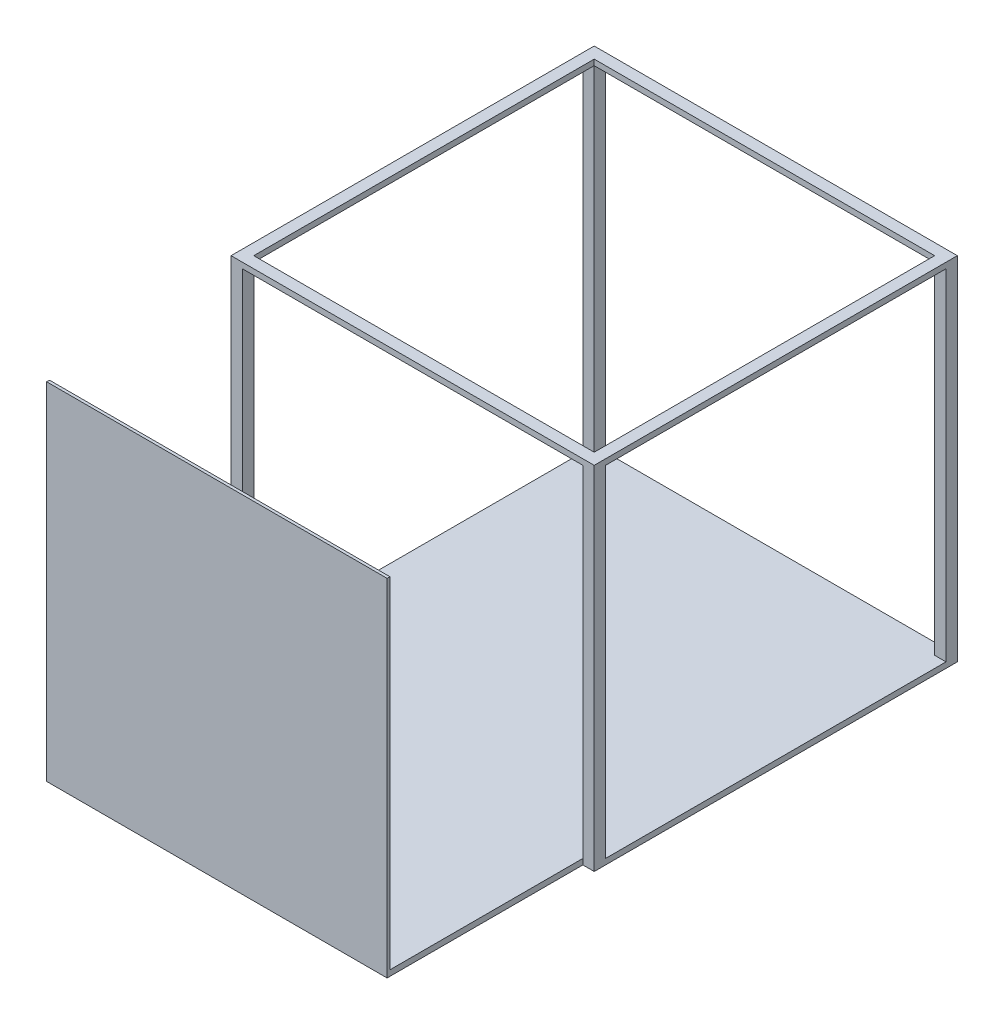
ISO-10303-21;
HEADER;
FILE_DESCRIPTION(('STEP AP214'),'2;1');
FILE_NAME('part.step','',(''),(''),'','','');
FILE_SCHEMA(('AUTOMOTIVE_DESIGN { 1 0 10303 214 1 1 1 1 }'));
ENDSEC;
DATA;
#1=APPLICATION_CONTEXT('core data for automotive mechanical design processes');
#2=APPLICATION_PROTOCOL_DEFINITION('international standard','automotive_design',2000,#1);
#3=PRODUCT_CONTEXT('',#1,'mechanical');
#4=PRODUCT('Part','Part','',(#3));
#5=PRODUCT_RELATED_PRODUCT_CATEGORY('part','',(#4));
#6=PRODUCT_DEFINITION_FORMATION('','',#4);
#7=PRODUCT_DEFINITION_CONTEXT('part definition',#1,'design');
#8=PRODUCT_DEFINITION('design','',#6,#7);
#9=PRODUCT_DEFINITION_SHAPE('','',#8);
#10=(LENGTH_UNIT() NAMED_UNIT(*) SI_UNIT(.MILLI.,.METRE.));
#11=(NAMED_UNIT(*) PLANE_ANGLE_UNIT() SI_UNIT($,.RADIAN.));
#12=(NAMED_UNIT(*) SI_UNIT($,.STERADIAN.) SOLID_ANGLE_UNIT());
#13=UNCERTAINTY_MEASURE_WITH_UNIT(LENGTH_MEASURE(1.E-05),#10,'distance_accuracy_value','');
#14=(GEOMETRIC_REPRESENTATION_CONTEXT(3) GLOBAL_UNCERTAINTY_ASSIGNED_CONTEXT((#13)) GLOBAL_UNIT_ASSIGNED_CONTEXT((#10,
#11,#12)) REPRESENTATION_CONTEXT('',''));
#15=CARTESIAN_POINT('',(0.,0.,0.));
#16=DIRECTION('',(0.,0.,1.));
#17=DIRECTION('',(1.,0.,0.));
#18=AXIS2_PLACEMENT_3D('',#15,#16,#17);
#19=CARTESIAN_POINT('',(0.,6.35,0.));
#20=DIRECTION('',(0.,-1.,0.));
#21=DIRECTION('',(0.,0.,-1.));
#22=AXIS2_PLACEMENT_3D('',#19,#20,#21);
#23=PLANE('',#22);
#24=DIRECTION('',(-1.,0.,0.));
#25=VECTOR('',#24,1.);
#26=CARTESIAN_POINT('',(-203.2,6.35,190.5));
#27=LINE('',#26,#25);
#28=CARTESIAN_POINT('',(-190.5,6.35,190.5));
#29=VERTEX_POINT('',#28);
#30=CARTESIAN_POINT('',(-203.2,6.35,190.5));
#31=VERTEX_POINT('',#30);
#32=EDGE_CURVE('E74',#29,#31,#27,.T.);
#33=ORIENTED_EDGE('',*,*,#32,.F.);
#34=DIRECTION('',(0.,0.,-1.));
#35=VECTOR('',#34,1.);
#36=CARTESIAN_POINT('',(-190.5,6.35,203.2));
#37=LINE('',#36,#35);
#38=CARTESIAN_POINT('',(-190.5,6.35,203.2));
#39=VERTEX_POINT('',#38);
#40=EDGE_CURVE('E403',#39,#29,#37,.T.);
#41=ORIENTED_EDGE('',*,*,#40,.F.);
#42=DIRECTION('',(0.,0.,1.));
#43=VECTOR('',#42,1.);
#44=CARTESIAN_POINT('',(-190.5,6.35,190.5));
#45=LINE('',#44,#43);
#46=CARTESIAN_POINT('',(-190.5,6.35,419.1));
#47=VERTEX_POINT('',#46);
#48=EDGE_CURVE('E292',#39,#47,#45,.T.);
#49=ORIENTED_EDGE('',*,*,#48,.T.);
#50=DIRECTION('',(1.,0.,0.));
#51=VECTOR('',#50,1.);
#52=CARTESIAN_POINT('',(-190.5,6.35,419.1));
#53=LINE('',#52,#51);
#54=CARTESIAN_POINT('',(190.5,6.35,419.1));
#55=VERTEX_POINT('',#54);
#56=EDGE_CURVE('E300',#47,#55,#53,.T.);
#57=ORIENTED_EDGE('',*,*,#56,.T.);
#58=DIRECTION('',(0.,0.,-1.));
#59=VECTOR('',#58,1.);
#60=CARTESIAN_POINT('',(190.5,6.35,190.5));
#61=LINE('',#60,#59);
#62=CARTESIAN_POINT('',(190.5,6.35,203.2));
#63=VERTEX_POINT('',#62);
#64=EDGE_CURVE('E257',#55,#63,#61,.T.);
#65=ORIENTED_EDGE('',*,*,#64,.T.);
#66=DIRECTION('',(0.,0.,1.));
#67=VECTOR('',#66,1.);
#68=CARTESIAN_POINT('',(190.5,6.35,203.2));
#69=LINE('',#68,#67);
#70=CARTESIAN_POINT('',(190.5,6.35,190.5));
#71=VERTEX_POINT('',#70);
#72=EDGE_CURVE('E426',#71,#63,#69,.T.);
#73=ORIENTED_EDGE('',*,*,#72,.F.);
#74=DIRECTION('',(-1.,0.,0.));
#75=VECTOR('',#74,1.);
#76=CARTESIAN_POINT('',(203.2,6.35,190.5));
#77=LINE('',#76,#75);
#78=CARTESIAN_POINT('',(203.2,6.35,190.5));
#79=VERTEX_POINT('',#78);
#80=EDGE_CURVE('E430',#79,#71,#77,.T.);
#81=ORIENTED_EDGE('',*,*,#80,.F.);
#82=DIRECTION('',(0.,0.,-1.));
#83=VECTOR('',#82,1.);
#84=CARTESIAN_POINT('',(203.2,6.35,203.2));
#85=LINE('',#84,#83);
#86=CARTESIAN_POINT('',(203.2,6.35,-190.5));
#87=VERTEX_POINT('',#86);
#88=EDGE_CURVE('E493',#79,#87,#85,.T.);
#89=ORIENTED_EDGE('',*,*,#88,.T.);
#90=DIRECTION('',(1.,0.,0.));
#91=VECTOR('',#90,1.);
#92=CARTESIAN_POINT('',(203.2,6.35,-190.5));
#93=LINE('',#92,#91);
#94=CARTESIAN_POINT('',(190.5,6.35,-190.5));
#95=VERTEX_POINT('',#94);
#96=EDGE_CURVE('E453',#95,#87,#93,.T.);
#97=ORIENTED_EDGE('',*,*,#96,.F.);
#98=DIRECTION('',(0.,0.,1.));
#99=VECTOR('',#98,1.);
#100=CARTESIAN_POINT('',(190.5,6.35,-203.2));
#101=LINE('',#100,#99);
#102=CARTESIAN_POINT('',(190.5,6.35,-203.2));
#103=VERTEX_POINT('',#102);
#104=EDGE_CURVE('E456',#103,#95,#101,.T.);
#105=ORIENTED_EDGE('',*,*,#104,.F.);
#106=DIRECTION('',(-1.,0.,0.));
#107=VECTOR('',#106,1.);
#108=CARTESIAN_POINT('',(-203.2,6.35,-203.2));
#109=LINE('',#108,#107);
#110=CARTESIAN_POINT('',(-190.5,6.35,-203.2));
#111=VERTEX_POINT('',#110);
#112=EDGE_CURVE('E496',#103,#111,#109,.T.);
#113=ORIENTED_EDGE('',*,*,#112,.T.);
#114=DIRECTION('',(0.,0.,-1.));
#115=VECTOR('',#114,1.);
#116=CARTESIAN_POINT('',(-190.5,6.35,-203.2));
#117=LINE('',#116,#115);
#118=CARTESIAN_POINT('',(-190.5,6.35,-190.5));
#119=VERTEX_POINT('',#118);
#120=EDGE_CURVE('E472',#119,#111,#117,.T.);
#121=ORIENTED_EDGE('',*,*,#120,.F.);
#122=DIRECTION('',(1.,0.,0.));
#123=VECTOR('',#122,1.);
#124=CARTESIAN_POINT('',(-203.2,6.35,-190.5));
#125=LINE('',#124,#123);
#126=CARTESIAN_POINT('',(-203.2,6.35,-190.5));
#127=VERTEX_POINT('',#126);
#128=EDGE_CURVE('E460',#127,#119,#125,.T.);
#129=ORIENTED_EDGE('',*,*,#128,.F.);
#130=DIRECTION('',(0.,0.,1.));
#131=VECTOR('',#130,1.);
#132=CARTESIAN_POINT('',(-203.2,6.35,203.2));
#133=LINE('',#132,#131);
#134=EDGE_CURVE('E81',#127,#31,#133,.T.);
#135=ORIENTED_EDGE('',*,*,#134,.T.);
#136=EDGE_LOOP('',(#33,#41,#49,#57,#65,#73,#81,#89,#97,#105,#113,#121,#129,#135));
#137=FACE_BOUND('',#136,.T.);
#138=ADVANCED_FACE('F55',(#137),#23,.F.);
#139=CARTESIAN_POINT('',(203.2,6.35,203.2));
#140=DIRECTION('',(-1.,0.,0.));
#141=DIRECTION('',(0.,0.,1.));
#142=AXIS2_PLACEMENT_3D('',#139,#140,#141);
#143=PLANE('',#142);
#144=DIRECTION('',(0.,-1.,0.));
#145=VECTOR('',#144,1.);
#146=CARTESIAN_POINT('',(203.2,6.35,-203.2));
#147=LINE('',#146,#145);
#148=CARTESIAN_POINT('',(203.2,393.7,-203.2));
#149=VERTEX_POINT('',#148);
#150=CARTESIAN_POINT('',(203.2,0.,-203.2));
#151=VERTEX_POINT('',#150);
#152=EDGE_CURVE('E11',#149,#151,#147,.T.);
#153=ORIENTED_EDGE('',*,*,#152,.F.);
#154=DIRECTION('',(0.,0.,-1.));
#155=VECTOR('',#154,1.);
#156=CARTESIAN_POINT('',(203.2,393.7,-203.2));
#157=LINE('',#156,#155);
#158=CARTESIAN_POINT('',(203.2,393.7,203.2));
#159=VERTEX_POINT('',#158);
#160=EDGE_CURVE('E366',#159,#149,#157,.T.);
#161=ORIENTED_EDGE('',*,*,#160,.F.);
#162=DIRECTION('',(0.,-1.,0.));
#163=VECTOR('',#162,1.);
#164=CARTESIAN_POINT('',(203.2,6.35,203.2));
#165=LINE('',#164,#163);
#166=CARTESIAN_POINT('',(203.2,0.,203.2));
#167=VERTEX_POINT('',#166);
#168=EDGE_CURVE('E501',#159,#167,#165,.T.);
#169=ORIENTED_EDGE('',*,*,#168,.T.);
#170=DIRECTION('',(0.,0.,-1.));
#171=VECTOR('',#170,1.);
#172=CARTESIAN_POINT('',(203.2,0.,203.2));
#173=LINE('',#172,#171);
#174=EDGE_CURVE('E492',#167,#151,#173,.T.);
#175=ORIENTED_EDGE('',*,*,#174,.T.);
#176=EDGE_LOOP('',(#153,#161,#169,#175));
#177=FACE_BOUND('',#176,.T.);
#178=DIRECTION('',(0.,0.,-1.));
#179=VECTOR('',#178,1.);
#180=CARTESIAN_POINT('',(203.2,387.35,-203.2));
#181=LINE('',#180,#179);
#182=CARTESIAN_POINT('',(203.2,387.35,190.5));
#183=VERTEX_POINT('',#182);
#184=CARTESIAN_POINT('',(203.2,387.35,-190.5));
#185=VERTEX_POINT('',#184);
#186=EDGE_CURVE('E382',#183,#185,#181,.T.);
#187=ORIENTED_EDGE('',*,*,#186,.T.);
#188=DIRECTION('',(0.,-1.,0.));
#189=VECTOR('',#188,1.);
#190=CARTESIAN_POINT('',(203.2,387.35,-190.5));
#191=LINE('',#190,#189);
#192=EDGE_CURVE('E449',#185,#87,#191,.T.);
#193=ORIENTED_EDGE('',*,*,#192,.T.);
#194=ORIENTED_EDGE('',*,*,#88,.F.);
#195=DIRECTION('',(0.,-1.,0.));
#196=VECTOR('',#195,1.);
#197=CARTESIAN_POINT('',(203.2,387.35,190.5));
#198=LINE('',#197,#196);
#199=EDGE_CURVE('E407',#183,#79,#198,.T.);
#200=ORIENTED_EDGE('',*,*,#199,.F.);
#201=EDGE_LOOP('',(#187,#193,#194,#200));
#202=FACE_BOUND('',#201,.T.);
#203=ADVANCED_FACE('F57',(#177,#202),#143,.F.);
#204=CARTESIAN_POINT('',(-203.2,6.35,-203.2));
#205=DIRECTION('',(0.,0.,1.));
#206=DIRECTION('',(1.,0.,0.));
#207=AXIS2_PLACEMENT_3D('',#204,#205,#206);
#208=PLANE('',#207);
#209=DIRECTION('',(0.,-1.,0.));
#210=VECTOR('',#209,1.);
#211=CARTESIAN_POINT('',(-203.2,6.35,-203.2));
#212=LINE('',#211,#210);
#213=CARTESIAN_POINT('',(-203.2,393.7,-203.2));
#214=VERTEX_POINT('',#213);
#215=CARTESIAN_POINT('',(-203.2,0.,-203.2));
#216=VERTEX_POINT('',#215);
#217=EDGE_CURVE('E64',#214,#216,#212,.T.);
#218=ORIENTED_EDGE('',*,*,#217,.F.);
#219=DIRECTION('',(-1.,0.,0.));
#220=VECTOR('',#219,1.);
#221=CARTESIAN_POINT('',(-203.2,393.7,-203.2));
#222=LINE('',#221,#220);
#223=EDGE_CURVE('E370',#149,#214,#222,.T.);
#224=ORIENTED_EDGE('',*,*,#223,.F.);
#225=ORIENTED_EDGE('',*,*,#152,.T.);
#226=DIRECTION('',(-1.,0.,0.));
#227=VECTOR('',#226,1.);
#228=CARTESIAN_POINT('',(-203.2,0.,-203.2));
#229=LINE('',#228,#227);
#230=EDGE_CURVE('E505',#151,#216,#229,.T.);
#231=ORIENTED_EDGE('',*,*,#230,.T.);
#232=EDGE_LOOP('',(#218,#224,#225,#231));
#233=FACE_BOUND('',#232,.T.);
#234=DIRECTION('',(-1.,0.,0.));
#235=VECTOR('',#234,1.);
#236=CARTESIAN_POINT('',(-203.2,387.35,-203.2));
#237=LINE('',#236,#235);
#238=CARTESIAN_POINT('',(190.5,387.35,-203.2));
#239=VERTEX_POINT('',#238);
#240=CARTESIAN_POINT('',(-190.5,387.35,-203.2));
#241=VERTEX_POINT('',#240);
#242=EDGE_CURVE('E362',#239,#241,#237,.T.);
#243=ORIENTED_EDGE('',*,*,#242,.T.);
#244=DIRECTION('',(0.,-1.,0.));
#245=VECTOR('',#244,1.);
#246=CARTESIAN_POINT('',(-190.5,387.35,-203.2));
#247=LINE('',#246,#245);
#248=EDGE_CURVE('E476',#241,#111,#247,.T.);
#249=ORIENTED_EDGE('',*,*,#248,.T.);
#250=ORIENTED_EDGE('',*,*,#112,.F.);
#251=DIRECTION('',(0.,-1.,0.));
#252=VECTOR('',#251,1.);
#253=CARTESIAN_POINT('',(190.5,387.35,-203.2));
#254=LINE('',#253,#252);
#255=EDGE_CURVE('E435',#239,#103,#254,.T.);
#256=ORIENTED_EDGE('',*,*,#255,.F.);
#257=EDGE_LOOP('',(#243,#249,#250,#256));
#258=FACE_BOUND('',#257,.T.);
#259=ADVANCED_FACE('F535',(#233,#258),#208,.F.);
#260=CARTESIAN_POINT('',(-203.2,6.35,203.2));
#261=DIRECTION('',(1.,0.,0.));
#262=DIRECTION('',(0.,0.,-1.));
#263=AXIS2_PLACEMENT_3D('',#260,#261,#262);
#264=PLANE('',#263);
#265=DIRECTION('',(0.,-1.,0.));
#266=VECTOR('',#265,1.);
#267=CARTESIAN_POINT('',(-203.2,387.35,-190.5));
#268=LINE('',#267,#266);
#269=CARTESIAN_POINT('',(-203.2,387.35,-190.5));
#270=VERTEX_POINT('',#269);
#271=EDGE_CURVE('E488',#270,#127,#268,.T.);
#272=ORIENTED_EDGE('',*,*,#271,.F.);
#273=DIRECTION('',(0.,0.,1.));
#274=VECTOR('',#273,1.);
#275=CARTESIAN_POINT('',(-203.2,387.35,-203.2));
#276=LINE('',#275,#274);
#277=CARTESIAN_POINT('',(-203.2,387.35,190.5));
#278=VERTEX_POINT('',#277);
#279=EDGE_CURVE('E356',#270,#278,#276,.T.);
#280=ORIENTED_EDGE('',*,*,#279,.T.);
#281=DIRECTION('',(0.,-1.,0.));
#282=VECTOR('',#281,1.);
#283=CARTESIAN_POINT('',(-203.2,387.35,190.5));
#284=LINE('',#283,#282);
#285=EDGE_CURVE('E396',#278,#31,#284,.T.);
#286=ORIENTED_EDGE('',*,*,#285,.T.);
#287=ORIENTED_EDGE('',*,*,#134,.F.);
#288=EDGE_LOOP('',(#272,#280,#286,#287));
#289=FACE_BOUND('',#288,.T.);
#290=DIRECTION('',(0.,0.,1.));
#291=VECTOR('',#290,1.);
#292=CARTESIAN_POINT('',(-203.2,0.,203.2));
#293=LINE('',#292,#291);
#294=CARTESIAN_POINT('',(-203.2,0.,203.2));
#295=VERTEX_POINT('',#294);
#296=EDGE_CURVE('E507',#216,#295,#293,.T.);
#297=ORIENTED_EDGE('',*,*,#296,.T.);
#298=DIRECTION('',(0.,-1.,0.));
#299=VECTOR('',#298,1.);
#300=CARTESIAN_POINT('',(-203.2,6.35,203.2));
#301=LINE('',#300,#299);
#302=CARTESIAN_POINT('',(-203.2,393.7,203.2));
#303=VERTEX_POINT('',#302);
#304=EDGE_CURVE('E516',#303,#295,#301,.T.);
#305=ORIENTED_EDGE('',*,*,#304,.F.);
#306=DIRECTION('',(0.,0.,1.));
#307=VECTOR('',#306,1.);
#308=CARTESIAN_POINT('',(-203.2,393.7,-203.2));
#309=LINE('',#308,#307);
#310=EDGE_CURVE('E357',#214,#303,#309,.T.);
#311=ORIENTED_EDGE('',*,*,#310,.F.);
#312=ORIENTED_EDGE('',*,*,#217,.T.);
#313=EDGE_LOOP('',(#297,#305,#311,#312));
#314=FACE_BOUND('',#313,.T.);
#315=ADVANCED_FACE('F524',(#289,#314),#264,.F.);
#316=CARTESIAN_POINT('',(-203.2,6.35,203.2));
#317=DIRECTION('',(0.,0.,-1.));
#318=DIRECTION('',(-1.,0.,0.));
#319=AXIS2_PLACEMENT_3D('',#316,#317,#318);
#320=PLANE('',#319);
#321=DIRECTION('',(1.,0.,0.));
#322=VECTOR('',#321,1.);
#323=CARTESIAN_POINT('',(-203.2,0.,203.2));
#324=LINE('',#323,#322);
#325=CARTESIAN_POINT('',(-190.5,0.,203.2));
#326=VERTEX_POINT('',#325);
#327=EDGE_CURVE('E497',#295,#326,#324,.T.);
#328=ORIENTED_EDGE('',*,*,#327,.T.);
#329=DIRECTION('',(0.,1.,0.));
#330=VECTOR('',#329,1.);
#331=CARTESIAN_POINT('',(-190.5,6.35,203.2));
#332=LINE('',#331,#330);
#333=EDGE_CURVE('E251',#326,#39,#332,.T.);
#334=ORIENTED_EDGE('',*,*,#333,.T.);
#335=DIRECTION('',(0.,-1.,0.));
#336=VECTOR('',#335,1.);
#337=CARTESIAN_POINT('',(-190.5,387.35,203.2));
#338=LINE('',#337,#336);
#339=CARTESIAN_POINT('',(-190.5,387.35,203.2));
#340=VERTEX_POINT('',#339);
#341=EDGE_CURVE('E374',#340,#39,#338,.T.);
#342=ORIENTED_EDGE('',*,*,#341,.F.);
#343=DIRECTION('',(1.,0.,0.));
#344=VECTOR('',#343,1.);
#345=CARTESIAN_POINT('',(-203.2,387.35,203.2));
#346=LINE('',#345,#344);
#347=CARTESIAN_POINT('',(190.5,387.35,203.2));
#348=VERTEX_POINT('',#347);
#349=EDGE_CURVE('E378',#340,#348,#346,.T.);
#350=ORIENTED_EDGE('',*,*,#349,.T.);
#351=DIRECTION('',(0.,-1.,0.));
#352=VECTOR('',#351,1.);
#353=CARTESIAN_POINT('',(190.5,387.35,203.2));
#354=LINE('',#353,#352);
#355=EDGE_CURVE('E421',#348,#63,#354,.T.);
#356=ORIENTED_EDGE('',*,*,#355,.T.);
#357=DIRECTION('',(0.,-1.,0.));
#358=VECTOR('',#357,1.);
#359=CARTESIAN_POINT('',(190.5,6.35,203.2));
#360=LINE('',#359,#358);
#361=CARTESIAN_POINT('',(190.5,0.,203.2));
#362=VERTEX_POINT('',#361);
#363=EDGE_CURVE('E296',#63,#362,#360,.T.);
#364=ORIENTED_EDGE('',*,*,#363,.T.);
#365=EDGE_CURVE('E510',#362,#167,#324,.T.);
#366=ORIENTED_EDGE('',*,*,#365,.T.);
#367=ORIENTED_EDGE('',*,*,#168,.F.);
#368=DIRECTION('',(1.,0.,0.));
#369=VECTOR('',#368,1.);
#370=CARTESIAN_POINT('',(-203.2,393.7,203.2));
#371=LINE('',#370,#369);
#372=EDGE_CURVE('E361',#303,#159,#371,.T.);
#373=ORIENTED_EDGE('',*,*,#372,.F.);
#374=ORIENTED_EDGE('',*,*,#304,.T.);
#375=EDGE_LOOP('',(#328,#334,#342,#350,#356,#364,#366,#367,#373,#374));
#376=FACE_BOUND('',#375,.T.);
#377=ADVANCED_FACE('F529',(#376),#320,.F.);
#378=CARTESIAN_POINT('',(0.,0.,0.));
#379=DIRECTION('',(0.,-1.,0.));
#380=DIRECTION('',(0.,0.,-1.));
#381=AXIS2_PLACEMENT_3D('',#378,#379,#380);
#382=PLANE('',#381);
#383=ORIENTED_EDGE('',*,*,#365,.F.);
#384=DIRECTION('',(0.,0.,-1.));
#385=VECTOR('',#384,1.);
#386=CARTESIAN_POINT('',(190.5,0.,190.5));
#387=LINE('',#386,#385);
#388=CARTESIAN_POINT('',(190.5,0.,422.275));
#389=VERTEX_POINT('',#388);
#390=EDGE_CURVE('E256',#389,#362,#387,.T.);
#391=ORIENTED_EDGE('',*,*,#390,.F.);
#392=DIRECTION('',(1.,0.,0.));
#393=VECTOR('',#392,1.);
#394=CARTESIAN_POINT('',(-190.5,0.,422.275));
#395=LINE('',#394,#393);
#396=CARTESIAN_POINT('',(-190.5,0.,422.275));
#397=VERTEX_POINT('',#396);
#398=EDGE_CURVE('E260',#397,#389,#395,.T.);
#399=ORIENTED_EDGE('',*,*,#398,.F.);
#400=DIRECTION('',(0.,0.,1.));
#401=VECTOR('',#400,1.);
#402=CARTESIAN_POINT('',(-190.5,0.,190.5));
#403=LINE('',#402,#401);
#404=EDGE_CURVE('E244',#326,#397,#403,.T.);
#405=ORIENTED_EDGE('',*,*,#404,.F.);
#406=ORIENTED_EDGE('',*,*,#327,.F.);
#407=ORIENTED_EDGE('',*,*,#296,.F.);
#408=ORIENTED_EDGE('',*,*,#230,.F.);
#409=ORIENTED_EDGE('',*,*,#174,.F.);
#410=EDGE_LOOP('',(#383,#391,#399,#405,#406,#407,#408,#409));
#411=FACE_BOUND('',#410,.T.);
#412=ADVANCED_FACE('F262',(#411),#382,.T.);
#413=CARTESIAN_POINT('',(-203.2,387.35,-190.5));
#414=DIRECTION('',(0.,0.,-1.));
#415=DIRECTION('',(-1.,0.,0.));
#416=AXIS2_PLACEMENT_3D('',#413,#414,#415);
#417=PLANE('',#416);
#418=ORIENTED_EDGE('',*,*,#128,.T.);
#419=DIRECTION('',(0.,-1.,0.));
#420=VECTOR('',#419,1.);
#421=CARTESIAN_POINT('',(-190.5,387.35,-190.5));
#422=LINE('',#421,#420);
#423=CARTESIAN_POINT('',(-190.5,387.35,-190.5));
#424=VERTEX_POINT('',#423);
#425=EDGE_CURVE('E484',#424,#119,#422,.T.);
#426=ORIENTED_EDGE('',*,*,#425,.F.);
#427=DIRECTION('',(1.,0.,0.));
#428=VECTOR('',#427,1.);
#429=CARTESIAN_POINT('',(-203.2,387.35,-190.5));
#430=LINE('',#429,#428);
#431=EDGE_CURVE('E467',#270,#424,#430,.T.);
#432=ORIENTED_EDGE('',*,*,#431,.F.);
#433=ORIENTED_EDGE('',*,*,#271,.T.);
#434=EDGE_LOOP('',(#418,#426,#432,#433));
#435=FACE_BOUND('',#434,.T.);
#436=ADVANCED_FACE('F597',(#435),#417,.F.);
#437=CARTESIAN_POINT('',(-190.5,387.35,-203.2));
#438=DIRECTION('',(-1.,0.,0.));
#439=DIRECTION('',(0.,0.,1.));
#440=AXIS2_PLACEMENT_3D('',#437,#438,#439);
#441=PLANE('',#440);
#442=ORIENTED_EDGE('',*,*,#120,.T.);
#443=ORIENTED_EDGE('',*,*,#248,.F.);
#444=DIRECTION('',(0.,0.,-1.));
#445=VECTOR('',#444,1.);
#446=CARTESIAN_POINT('',(-190.5,387.35,-203.2));
#447=LINE('',#446,#445);
#448=EDGE_CURVE('E471',#424,#241,#447,.T.);
#449=ORIENTED_EDGE('',*,*,#448,.F.);
#450=ORIENTED_EDGE('',*,*,#425,.T.);
#451=EDGE_LOOP('',(#442,#443,#449,#450));
#452=FACE_BOUND('',#451,.T.);
#453=ADVANCED_FACE('F561',(#452),#441,.F.);
#454=CARTESIAN_POINT('',(190.5,387.35,-203.2));
#455=DIRECTION('',(1.,0.,0.));
#456=DIRECTION('',(0.,0.,-1.));
#457=AXIS2_PLACEMENT_3D('',#454,#455,#456);
#458=PLANE('',#457);
#459=ORIENTED_EDGE('',*,*,#104,.T.);
#460=DIRECTION('',(0.,-1.,0.));
#461=VECTOR('',#460,1.);
#462=CARTESIAN_POINT('',(190.5,387.35,-190.5));
#463=LINE('',#462,#461);
#464=CARTESIAN_POINT('',(190.5,387.35,-190.5));
#465=VERTEX_POINT('',#464);
#466=EDGE_CURVE('E445',#465,#95,#463,.T.);
#467=ORIENTED_EDGE('',*,*,#466,.F.);
#468=DIRECTION('',(0.,0.,1.));
#469=VECTOR('',#468,1.);
#470=CARTESIAN_POINT('',(190.5,387.35,-203.2));
#471=LINE('',#470,#469);
#472=EDGE_CURVE('E457',#239,#465,#471,.T.);
#473=ORIENTED_EDGE('',*,*,#472,.F.);
#474=ORIENTED_EDGE('',*,*,#255,.T.);
#475=EDGE_LOOP('',(#459,#467,#473,#474));
#476=FACE_BOUND('',#475,.T.);
#477=ADVANCED_FACE('F558',(#476),#458,.F.);
#478=CARTESIAN_POINT('',(203.2,387.35,-190.5));
#479=DIRECTION('',(0.,0.,-1.));
#480=DIRECTION('',(-1.,0.,0.));
#481=AXIS2_PLACEMENT_3D('',#478,#479,#480);
#482=PLANE('',#481);
#483=ORIENTED_EDGE('',*,*,#96,.T.);
#484=ORIENTED_EDGE('',*,*,#192,.F.);
#485=DIRECTION('',(1.,0.,0.));
#486=VECTOR('',#485,1.);
#487=CARTESIAN_POINT('',(203.2,387.35,-190.5));
#488=LINE('',#487,#486);
#489=EDGE_CURVE('E452',#465,#185,#488,.T.);
#490=ORIENTED_EDGE('',*,*,#489,.F.);
#491=ORIENTED_EDGE('',*,*,#466,.T.);
#492=EDGE_LOOP('',(#483,#484,#490,#491));
#493=FACE_BOUND('',#492,.T.);
#494=ADVANCED_FACE('F554',(#493),#482,.F.);
#495=CARTESIAN_POINT('',(203.2,387.35,190.5));
#496=DIRECTION('',(0.,0.,1.));
#497=DIRECTION('',(1.,0.,0.));
#498=AXIS2_PLACEMENT_3D('',#495,#496,#497);
#499=PLANE('',#498);
#500=ORIENTED_EDGE('',*,*,#80,.T.);
#501=DIRECTION('',(0.,-1.,0.));
#502=VECTOR('',#501,1.);
#503=CARTESIAN_POINT('',(190.5,387.35,190.5));
#504=LINE('',#503,#502);
#505=CARTESIAN_POINT('',(190.5,387.35,190.5));
#506=VERTEX_POINT('',#505);
#507=EDGE_CURVE('E417',#506,#71,#504,.T.);
#508=ORIENTED_EDGE('',*,*,#507,.F.);
#509=DIRECTION('',(-1.,0.,0.));
#510=VECTOR('',#509,1.);
#511=CARTESIAN_POINT('',(203.2,387.35,190.5));
#512=LINE('',#511,#510);
#513=EDGE_CURVE('E431',#183,#506,#512,.T.);
#514=ORIENTED_EDGE('',*,*,#513,.F.);
#515=ORIENTED_EDGE('',*,*,#199,.T.);
#516=EDGE_LOOP('',(#500,#508,#514,#515));
#517=FACE_BOUND('',#516,.T.);
#518=ADVANCED_FACE('F549',(#517),#499,.F.);
#519=CARTESIAN_POINT('',(190.5,387.35,203.2));
#520=DIRECTION('',(1.,0.,0.));
#521=DIRECTION('',(0.,0.,-1.));
#522=AXIS2_PLACEMENT_3D('',#519,#520,#521);
#523=PLANE('',#522);
#524=ORIENTED_EDGE('',*,*,#72,.T.);
#525=ORIENTED_EDGE('',*,*,#355,.F.);
#526=DIRECTION('',(0.,0.,1.));
#527=VECTOR('',#526,1.);
#528=CARTESIAN_POINT('',(190.5,387.35,203.2));
#529=LINE('',#528,#527);
#530=EDGE_CURVE('E425',#506,#348,#529,.T.);
#531=ORIENTED_EDGE('',*,*,#530,.F.);
#532=ORIENTED_EDGE('',*,*,#507,.T.);
#533=EDGE_LOOP('',(#524,#525,#531,#532));
#534=FACE_BOUND('',#533,.T.);
#535=ADVANCED_FACE('F545',(#534),#523,.F.);
#536=CARTESIAN_POINT('',(-190.5,387.35,203.2));
#537=DIRECTION('',(-1.,0.,0.));
#538=DIRECTION('',(0.,0.,1.));
#539=AXIS2_PLACEMENT_3D('',#536,#537,#538);
#540=PLANE('',#539);
#541=ORIENTED_EDGE('',*,*,#40,.T.);
#542=DIRECTION('',(0.,-1.,0.));
#543=VECTOR('',#542,1.);
#544=CARTESIAN_POINT('',(-190.5,387.35,190.5));
#545=LINE('',#544,#543);
#546=CARTESIAN_POINT('',(-190.5,387.35,190.5));
#547=VERTEX_POINT('',#546);
#548=EDGE_CURVE('E392',#547,#29,#545,.T.);
#549=ORIENTED_EDGE('',*,*,#548,.F.);
#550=DIRECTION('',(0.,0.,-1.));
#551=VECTOR('',#550,1.);
#552=CARTESIAN_POINT('',(-190.5,387.35,203.2));
#553=LINE('',#552,#551);
#554=EDGE_CURVE('E404',#340,#547,#553,.T.);
#555=ORIENTED_EDGE('',*,*,#554,.F.);
#556=ORIENTED_EDGE('',*,*,#341,.T.);
#557=EDGE_LOOP('',(#541,#549,#555,#556));
#558=FACE_BOUND('',#557,.T.);
#559=ADVANCED_FACE('F592',(#558),#540,.F.);
#560=CARTESIAN_POINT('',(-203.2,387.35,190.5));
#561=DIRECTION('',(0.,0.,1.));
#562=DIRECTION('',(1.,0.,0.));
#563=AXIS2_PLACEMENT_3D('',#560,#561,#562);
#564=PLANE('',#563);
#565=ORIENTED_EDGE('',*,*,#32,.T.);
#566=ORIENTED_EDGE('',*,*,#285,.F.);
#567=DIRECTION('',(-1.,0.,0.));
#568=VECTOR('',#567,1.);
#569=CARTESIAN_POINT('',(-203.2,387.35,190.5));
#570=LINE('',#569,#568);
#571=EDGE_CURVE('E400',#547,#278,#570,.T.);
#572=ORIENTED_EDGE('',*,*,#571,.F.);
#573=ORIENTED_EDGE('',*,*,#548,.T.);
#574=EDGE_LOOP('',(#565,#566,#572,#573));
#575=FACE_BOUND('',#574,.T.);
#576=ADVANCED_FACE('F595',(#575),#564,.F.);
#577=CARTESIAN_POINT('',(0.,387.35,0.));
#578=DIRECTION('',(0.,1.,0.));
#579=DIRECTION('',(0.,0.,1.));
#580=AXIS2_PLACEMENT_3D('',#577,#578,#579);
#581=PLANE('',#580);
#582=ORIENTED_EDGE('',*,*,#279,.F.);
#583=ORIENTED_EDGE('',*,*,#431,.T.);
#584=DIRECTION('',(0.,0.,1.));
#585=VECTOR('',#584,1.);
#586=CARTESIAN_POINT('',(-190.5,387.35,-190.5));
#587=LINE('',#586,#585);
#588=EDGE_CURVE('E311',#424,#547,#587,.T.);
#589=ORIENTED_EDGE('',*,*,#588,.T.);
#590=ORIENTED_EDGE('',*,*,#571,.T.);
#591=EDGE_LOOP('',(#582,#583,#589,#590));
#592=FACE_BOUND('',#591,.T.);
#593=ADVANCED_FACE('F569',(#592),#581,.F.);
#594=DIRECTION('',(-1.,0.,0.));
#595=VECTOR('',#594,1.);
#596=CARTESIAN_POINT('',(-190.5,387.35,-190.5));
#597=LINE('',#596,#595);
#598=EDGE_CURVE('E316',#465,#424,#597,.T.);
#599=ORIENTED_EDGE('',*,*,#598,.T.);
#600=ORIENTED_EDGE('',*,*,#448,.T.);
#601=ORIENTED_EDGE('',*,*,#242,.F.);
#602=ORIENTED_EDGE('',*,*,#472,.T.);
#603=EDGE_LOOP('',(#599,#600,#601,#602));
#604=FACE_BOUND('',#603,.T.);
#605=ADVANCED_FACE('F564',(#604),#581,.F.);
#606=DIRECTION('',(0.,0.,-1.));
#607=VECTOR('',#606,1.);
#608=CARTESIAN_POINT('',(190.5,387.35,-190.5));
#609=LINE('',#608,#607);
#610=EDGE_CURVE('E334',#506,#465,#609,.T.);
#611=ORIENTED_EDGE('',*,*,#610,.T.);
#612=ORIENTED_EDGE('',*,*,#489,.T.);
#613=ORIENTED_EDGE('',*,*,#186,.F.);
#614=ORIENTED_EDGE('',*,*,#513,.T.);
#615=EDGE_LOOP('',(#611,#612,#613,#614));
#616=FACE_BOUND('',#615,.T.);
#617=ADVANCED_FACE('F641',(#616),#581,.F.);
#618=DIRECTION('',(1.,0.,0.));
#619=VECTOR('',#618,1.);
#620=CARTESIAN_POINT('',(-190.5,387.35,190.5));
#621=LINE('',#620,#619);
#622=EDGE_CURVE('E330',#547,#506,#621,.T.);
#623=ORIENTED_EDGE('',*,*,#622,.T.);
#624=ORIENTED_EDGE('',*,*,#530,.T.);
#625=ORIENTED_EDGE('',*,*,#349,.F.);
#626=ORIENTED_EDGE('',*,*,#554,.T.);
#627=EDGE_LOOP('',(#623,#624,#625,#626));
#628=FACE_BOUND('',#627,.T.);
#629=ADVANCED_FACE('F588',(#628),#581,.F.);
#630=CARTESIAN_POINT('',(0.,393.7,0.));
#631=DIRECTION('',(0.,1.,0.));
#632=DIRECTION('',(0.,0.,1.));
#633=AXIS2_PLACEMENT_3D('',#630,#631,#632);
#634=PLANE('',#633);
#635=ORIENTED_EDGE('',*,*,#310,.T.);
#636=ORIENTED_EDGE('',*,*,#372,.T.);
#637=ORIENTED_EDGE('',*,*,#160,.T.);
#638=ORIENTED_EDGE('',*,*,#223,.T.);
#639=EDGE_LOOP('',(#635,#636,#637,#638));
#640=FACE_BOUND('',#639,.T.);
#641=DIRECTION('',(1.,0.,0.));
#642=VECTOR('',#641,1.);
#643=CARTESIAN_POINT('',(-190.5,393.7,190.5));
#644=LINE('',#643,#642);
#645=CARTESIAN_POINT('',(-190.5,393.7,190.5));
#646=VERTEX_POINT('',#645);
#647=CARTESIAN_POINT('',(190.5,393.7,190.5));
#648=VERTEX_POINT('',#647);
#649=EDGE_CURVE('E315',#646,#648,#644,.T.);
#650=ORIENTED_EDGE('',*,*,#649,.F.);
#651=DIRECTION('',(0.,0.,1.));
#652=VECTOR('',#651,1.);
#653=CARTESIAN_POINT('',(-190.5,393.7,-190.5));
#654=LINE('',#653,#652);
#655=CARTESIAN_POINT('',(-190.5,393.7,-190.5));
#656=VERTEX_POINT('',#655);
#657=EDGE_CURVE('E312',#656,#646,#654,.T.);
#658=ORIENTED_EDGE('',*,*,#657,.F.);
#659=DIRECTION('',(-1.,0.,0.));
#660=VECTOR('',#659,1.);
#661=CARTESIAN_POINT('',(-190.5,393.7,-190.5));
#662=LINE('',#661,#660);
#663=CARTESIAN_POINT('',(190.5,393.7,-190.5));
#664=VERTEX_POINT('',#663);
#665=EDGE_CURVE('E323',#664,#656,#662,.T.);
#666=ORIENTED_EDGE('',*,*,#665,.F.);
#667=DIRECTION('',(0.,0.,-1.));
#668=VECTOR('',#667,1.);
#669=CARTESIAN_POINT('',(190.5,393.7,-190.5));
#670=LINE('',#669,#668);
#671=EDGE_CURVE('E319',#648,#664,#670,.T.);
#672=ORIENTED_EDGE('',*,*,#671,.F.);
#673=EDGE_LOOP('',(#650,#658,#666,#672));
#674=FACE_BOUND('',#673,.T.);
#675=ADVANCED_FACE('F533',(#640,#674),#634,.T.);
#676=CARTESIAN_POINT('',(-190.5,393.7,-190.5));
#677=DIRECTION('',(1.,0.,0.));
#678=DIRECTION('',(0.,0.,-1.));
#679=AXIS2_PLACEMENT_3D('',#676,#677,#678);
#680=PLANE('',#679);
#681=ORIENTED_EDGE('',*,*,#588,.F.);
#682=DIRECTION('',(0.,-1.,0.));
#683=VECTOR('',#682,1.);
#684=CARTESIAN_POINT('',(-190.5,393.7,-190.5));
#685=LINE('',#684,#683);
#686=EDGE_CURVE('E326',#656,#424,#685,.T.);
#687=ORIENTED_EDGE('',*,*,#686,.F.);
#688=ORIENTED_EDGE('',*,*,#657,.T.);
#689=DIRECTION('',(0.,-1.,0.));
#690=VECTOR('',#689,1.);
#691=CARTESIAN_POINT('',(-190.5,393.7,190.5));
#692=LINE('',#691,#690);
#693=EDGE_CURVE('E352',#646,#547,#692,.T.);
#694=ORIENTED_EDGE('',*,*,#693,.T.);
#695=EDGE_LOOP('',(#681,#687,#688,#694));
#696=FACE_BOUND('',#695,.T.);
#697=ADVANCED_FACE('F574',(#696),#680,.T.);
#698=CARTESIAN_POINT('',(-190.5,393.7,190.5));
#699=DIRECTION('',(0.,0.,-1.));
#700=DIRECTION('',(-1.,0.,0.));
#701=AXIS2_PLACEMENT_3D('',#698,#699,#700);
#702=PLANE('',#701);
#703=ORIENTED_EDGE('',*,*,#622,.F.);
#704=ORIENTED_EDGE('',*,*,#693,.F.);
#705=ORIENTED_EDGE('',*,*,#649,.T.);
#706=DIRECTION('',(0.,-1.,0.));
#707=VECTOR('',#706,1.);
#708=CARTESIAN_POINT('',(190.5,393.7,190.5));
#709=LINE('',#708,#707);
#710=EDGE_CURVE('E348',#648,#506,#709,.T.);
#711=ORIENTED_EDGE('',*,*,#710,.T.);
#712=EDGE_LOOP('',(#703,#704,#705,#711));
#713=FACE_BOUND('',#712,.T.);
#714=ADVANCED_FACE('F584',(#713),#702,.T.);
#715=CARTESIAN_POINT('',(190.5,393.7,-190.5));
#716=DIRECTION('',(-1.,0.,0.));
#717=DIRECTION('',(0.,0.,1.));
#718=AXIS2_PLACEMENT_3D('',#715,#716,#717);
#719=PLANE('',#718);
#720=ORIENTED_EDGE('',*,*,#610,.F.);
#721=ORIENTED_EDGE('',*,*,#710,.F.);
#722=ORIENTED_EDGE('',*,*,#671,.T.);
#723=DIRECTION('',(0.,-1.,0.));
#724=VECTOR('',#723,1.);
#725=CARTESIAN_POINT('',(190.5,393.7,-190.5));
#726=LINE('',#725,#724);
#727=EDGE_CURVE('E344',#664,#465,#726,.T.);
#728=ORIENTED_EDGE('',*,*,#727,.T.);
#729=EDGE_LOOP('',(#720,#721,#722,#728));
#730=FACE_BOUND('',#729,.T.);
#731=ADVANCED_FACE('F656',(#730),#719,.T.);
#732=CARTESIAN_POINT('',(-190.5,393.7,-190.5));
#733=DIRECTION('',(0.,0.,1.));
#734=DIRECTION('',(1.,0.,0.));
#735=AXIS2_PLACEMENT_3D('',#732,#733,#734);
#736=PLANE('',#735);
#737=ORIENTED_EDGE('',*,*,#598,.F.);
#738=ORIENTED_EDGE('',*,*,#727,.F.);
#739=ORIENTED_EDGE('',*,*,#665,.T.);
#740=ORIENTED_EDGE('',*,*,#686,.T.);
#741=EDGE_LOOP('',(#737,#738,#739,#740));
#742=FACE_BOUND('',#741,.T.);
#743=ADVANCED_FACE('F578',(#742),#736,.T.);
#744=CARTESIAN_POINT('',(-190.5,0.,190.5));
#745=DIRECTION('',(-1.,0.,0.));
#746=DIRECTION('',(0.,0.,1.));
#747=AXIS2_PLACEMENT_3D('',#744,#745,#746);
#748=PLANE('',#747);
#749=ORIENTED_EDGE('',*,*,#333,.F.);
#750=ORIENTED_EDGE('',*,*,#404,.T.);
#751=DIRECTION('',(0.,-1.,0.));
#752=VECTOR('',#751,1.);
#753=CARTESIAN_POINT('',(-190.5,0.,422.275));
#754=LINE('',#753,#752);
#755=CARTESIAN_POINT('',(-190.5,387.35,422.275));
#756=VERTEX_POINT('',#755);
#757=EDGE_CURVE('E249',#756,#397,#754,.T.);
#758=ORIENTED_EDGE('',*,*,#757,.F.);
#759=DIRECTION('',(0.,0.,-1.));
#760=VECTOR('',#759,1.);
#761=CARTESIAN_POINT('',(-190.5,387.35,422.275));
#762=LINE('',#761,#760);
#763=CARTESIAN_POINT('',(-190.5,387.35,419.1));
#764=VERTEX_POINT('',#763);
#765=EDGE_CURVE('E282',#756,#764,#762,.T.);
#766=ORIENTED_EDGE('',*,*,#765,.T.);
#767=DIRECTION('',(0.,-1.,0.));
#768=VECTOR('',#767,1.);
#769=CARTESIAN_POINT('',(-190.5,0.,419.1));
#770=LINE('',#769,#768);
#771=EDGE_CURVE('E283',#764,#47,#770,.T.);
#772=ORIENTED_EDGE('',*,*,#771,.T.);
#773=ORIENTED_EDGE('',*,*,#48,.F.);
#774=EDGE_LOOP('',(#749,#750,#758,#766,#772,#773));
#775=FACE_BOUND('',#774,.T.);
#776=ADVANCED_FACE('F246',(#775),#748,.T.);
#777=CARTESIAN_POINT('',(190.5,0.,190.5));
#778=DIRECTION('',(1.,0.,0.));
#779=DIRECTION('',(0.,0.,-1.));
#780=AXIS2_PLACEMENT_3D('',#777,#778,#779);
#781=PLANE('',#780);
#782=ORIENTED_EDGE('',*,*,#363,.F.);
#783=ORIENTED_EDGE('',*,*,#64,.F.);
#784=DIRECTION('',(0.,1.,0.));
#785=VECTOR('',#784,1.);
#786=CARTESIAN_POINT('',(190.5,0.,419.1));
#787=LINE('',#786,#785);
#788=CARTESIAN_POINT('',(190.5,387.35,419.1));
#789=VERTEX_POINT('',#788);
#790=EDGE_CURVE('E277',#55,#789,#787,.T.);
#791=ORIENTED_EDGE('',*,*,#790,.T.);
#792=DIRECTION('',(0.,0.,-1.));
#793=VECTOR('',#792,1.);
#794=CARTESIAN_POINT('',(190.5,387.35,422.275));
#795=LINE('',#794,#793);
#796=CARTESIAN_POINT('',(190.5,387.35,422.275));
#797=VERTEX_POINT('',#796);
#798=EDGE_CURVE('E290',#797,#789,#795,.T.);
#799=ORIENTED_EDGE('',*,*,#798,.F.);
#800=DIRECTION('',(0.,1.,0.));
#801=VECTOR('',#800,1.);
#802=CARTESIAN_POINT('',(190.5,0.,422.275));
#803=LINE('',#802,#801);
#804=EDGE_CURVE('E266',#389,#797,#803,.T.);
#805=ORIENTED_EDGE('',*,*,#804,.F.);
#806=ORIENTED_EDGE('',*,*,#390,.T.);
#807=EDGE_LOOP('',(#782,#783,#791,#799,#805,#806));
#808=FACE_BOUND('',#807,.T.);
#809=ADVANCED_FACE('F543',(#808),#781,.T.);
#810=CARTESIAN_POINT('',(0.,0.,419.1));
#811=DIRECTION('',(0.,0.,-1.));
#812=DIRECTION('',(-1.,0.,0.));
#813=AXIS2_PLACEMENT_3D('',#810,#811,#812);
#814=PLANE('',#813);
#815=ORIENTED_EDGE('',*,*,#56,.F.);
#816=ORIENTED_EDGE('',*,*,#771,.F.);
#817=DIRECTION('',(-1.,0.,0.));
#818=VECTOR('',#817,1.);
#819=CARTESIAN_POINT('',(-190.5,387.35,419.1));
#820=LINE('',#819,#818);
#821=EDGE_CURVE('E273',#789,#764,#820,.T.);
#822=ORIENTED_EDGE('',*,*,#821,.F.);
#823=ORIENTED_EDGE('',*,*,#790,.F.);
#824=EDGE_LOOP('',(#815,#816,#822,#823));
#825=FACE_BOUND('',#824,.T.);
#826=ADVANCED_FACE('F669',(#825),#814,.T.);
#827=CARTESIAN_POINT('',(-190.5,387.35,422.275));
#828=DIRECTION('',(0.,-1.,0.));
#829=DIRECTION('',(0.,0.,-1.));
#830=AXIS2_PLACEMENT_3D('',#827,#828,#829);
#831=PLANE('',#830);
#832=ORIENTED_EDGE('',*,*,#821,.T.);
#833=ORIENTED_EDGE('',*,*,#765,.F.);
#834=DIRECTION('',(-1.,0.,0.));
#835=VECTOR('',#834,1.);
#836=CARTESIAN_POINT('',(-190.5,387.35,422.275));
#837=LINE('',#836,#835);
#838=EDGE_CURVE('E270',#797,#756,#837,.T.);
#839=ORIENTED_EDGE('',*,*,#838,.F.);
#840=ORIENTED_EDGE('',*,*,#798,.T.);
#841=EDGE_LOOP('',(#832,#833,#839,#840));
#842=FACE_BOUND('',#841,.T.);
#843=ADVANCED_FACE('F674',(#842),#831,.F.);
#844=CARTESIAN_POINT('',(0.,0.,422.275));
#845=DIRECTION('',(0.,0.,-1.));
#846=DIRECTION('',(-1.,0.,0.));
#847=AXIS2_PLACEMENT_3D('',#844,#845,#846);
#848=PLANE('',#847);
#849=ORIENTED_EDGE('',*,*,#757,.T.);
#850=ORIENTED_EDGE('',*,*,#398,.T.);
#851=ORIENTED_EDGE('',*,*,#804,.T.);
#852=ORIENTED_EDGE('',*,*,#838,.T.);
#853=EDGE_LOOP('',(#849,#850,#851,#852));
#854=FACE_BOUND('',#853,.T.);
#855=ADVANCED_FACE('F268',(#854),#848,.F.);
#856=CLOSED_SHELL('',(#138,#203,#259,#315,#377,#412,#436,#453,#477,#494,#518,#535,#559,#576,
#593,#605,#617,#629,#675,#697,#714,#731,#743,#776,#809,#826,#843,#855));
#857=MANIFOLD_SOLID_BREP('B2',#856);
#858=ADVANCED_BREP_SHAPE_REPRESENTATION('',(#18,#857),#14);
#859=SHAPE_DEFINITION_REPRESENTATION(#9,#858);
ENDSEC;
END-ISO-10303-21;
